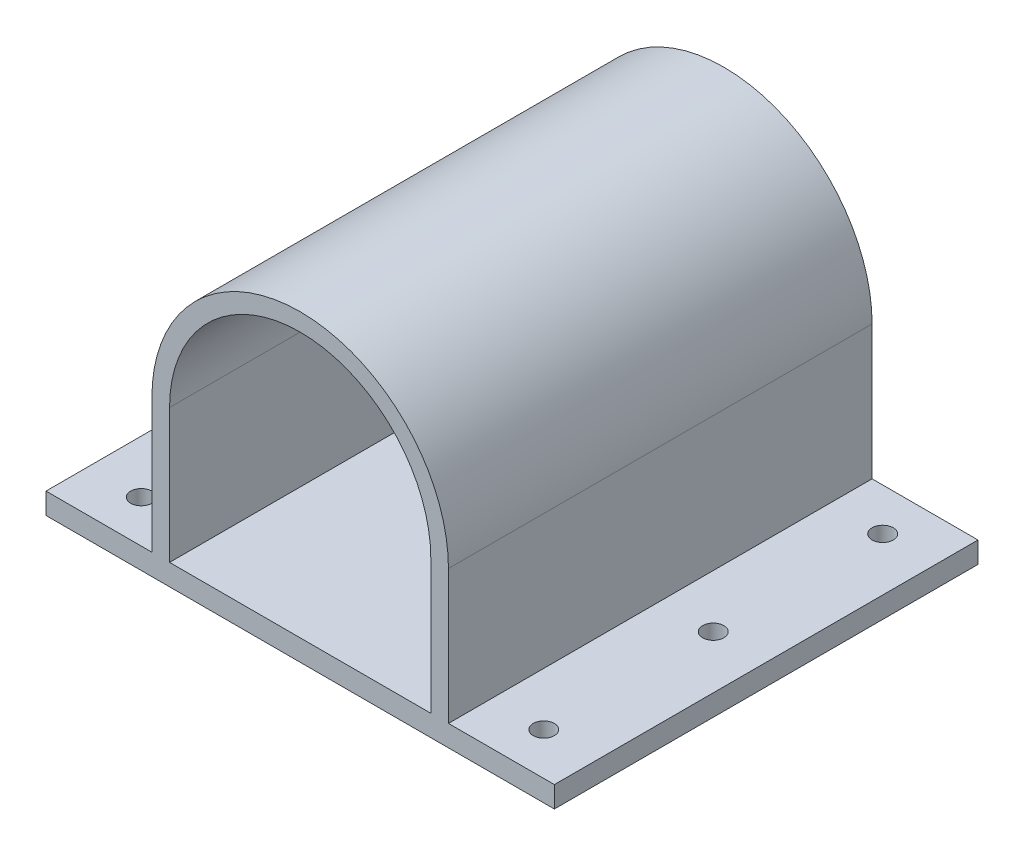
ISO-10303-21;
HEADER;
FILE_DESCRIPTION(('STEP AP214'),'2;1');
FILE_NAME('part.step','',(''),(''),'','','');
FILE_SCHEMA(('AUTOMOTIVE_DESIGN { 1 0 10303 214 1 1 1 1 }'));
ENDSEC;
DATA;
#1=APPLICATION_CONTEXT('core data for automotive mechanical design processes');
#2=APPLICATION_PROTOCOL_DEFINITION('international standard','automotive_design',2000,#1);
#3=PRODUCT_CONTEXT('',#1,'mechanical');
#4=PRODUCT('Part','Part','',(#3));
#5=PRODUCT_RELATED_PRODUCT_CATEGORY('part','',(#4));
#6=PRODUCT_DEFINITION_FORMATION('','',#4);
#7=PRODUCT_DEFINITION_CONTEXT('part definition',#1,'design');
#8=PRODUCT_DEFINITION('design','',#6,#7);
#9=PRODUCT_DEFINITION_SHAPE('','',#8);
#10=(LENGTH_UNIT() NAMED_UNIT(*) SI_UNIT(.MILLI.,.METRE.));
#11=(NAMED_UNIT(*) PLANE_ANGLE_UNIT() SI_UNIT($,.RADIAN.));
#12=(NAMED_UNIT(*) SI_UNIT($,.STERADIAN.) SOLID_ANGLE_UNIT());
#13=UNCERTAINTY_MEASURE_WITH_UNIT(LENGTH_MEASURE(1.E-05),#10,'distance_accuracy_value','');
#14=(GEOMETRIC_REPRESENTATION_CONTEXT(3) GLOBAL_UNCERTAINTY_ASSIGNED_CONTEXT((#13)) GLOBAL_UNIT_ASSIGNED_CONTEXT((#10,
#11,#12)) REPRESENTATION_CONTEXT('',''));
#15=CARTESIAN_POINT('',(0.,0.,0.));
#16=DIRECTION('',(0.,0.,1.));
#17=DIRECTION('',(1.,0.,0.));
#18=AXIS2_PLACEMENT_3D('',#15,#16,#17);
#19=CARTESIAN_POINT('',(0.,-7.,60.));
#20=DIRECTION('',(0.,0.,-1.));
#21=DIRECTION('',(-1.,0.,0.));
#22=AXIS2_PLACEMENT_3D('',#19,#20,#21);
#23=CYLINDRICAL_SURFACE('',#22,6.15);
#24=CARTESIAN_POINT('',(0.,-7.,0.));
#25=DIRECTION('',(0.,0.,1.));
#26=DIRECTION('',(1.,0.,0.));
#27=AXIS2_PLACEMENT_3D('',#24,#25,#26);
#28=CIRCLE('',#27,6.15);
#29=CARTESIAN_POINT('',(6.15,-7.,0.));
#30=VERTEX_POINT('',#29);
#31=EDGE_CURVE('E150',#30,#30,#28,.T.);
#32=ORIENTED_EDGE('',*,*,#31,.F.);
#33=EDGE_LOOP('',(#32));
#34=FACE_BOUND('',#33,.T.);
#35=CARTESIAN_POINT('',(0.,-7.,3.));
#36=DIRECTION('',(0.,0.,1.));
#37=DIRECTION('',(1.,0.,0.));
#38=AXIS2_PLACEMENT_3D('',#35,#36,#37);
#39=CIRCLE('',#38,6.15);
#40=CARTESIAN_POINT('',(6.15,-7.,3.));
#41=VERTEX_POINT('',#40);
#42=EDGE_CURVE('E217',#41,#41,#39,.T.);
#43=ORIENTED_EDGE('',*,*,#42,.T.);
#44=EDGE_LOOP('',(#43));
#45=FACE_BOUND('',#44,.T.);
#46=ADVANCED_FACE('F36',(#34,#45),#23,.F.);
#47=CARTESIAN_POINT('',(-15.5,0.,60.));
#48=DIRECTION('',(0.,0.,-1.));
#49=DIRECTION('',(-1.,0.,0.));
#50=AXIS2_PLACEMENT_3D('',#47,#48,#49);
#51=CYLINDRICAL_SURFACE('',#50,1.65);
#52=CARTESIAN_POINT('',(-15.5,0.,0.));
#53=DIRECTION('',(0.,0.,1.));
#54=DIRECTION('',(1.,0.,0.));
#55=AXIS2_PLACEMENT_3D('',#52,#53,#54);
#56=CIRCLE('',#55,1.65);
#57=CARTESIAN_POINT('',(-13.85,0.,0.));
#58=VERTEX_POINT('',#57);
#59=EDGE_CURVE('E199',#58,#58,#56,.T.);
#60=ORIENTED_EDGE('',*,*,#59,.F.);
#61=EDGE_LOOP('',(#60));
#62=FACE_BOUND('',#61,.T.);
#63=CARTESIAN_POINT('',(-15.5,0.,3.));
#64=DIRECTION('',(0.,0.,1.));
#65=DIRECTION('',(1.,0.,0.));
#66=AXIS2_PLACEMENT_3D('',#63,#64,#65);
#67=CIRCLE('',#66,1.65);
#68=CARTESIAN_POINT('',(-13.85,0.,3.));
#69=VERTEX_POINT('',#68);
#70=EDGE_CURVE('E220',#69,#69,#67,.T.);
#71=ORIENTED_EDGE('',*,*,#70,.T.);
#72=EDGE_LOOP('',(#71));
#73=FACE_BOUND('',#72,.T.);
#74=ADVANCED_FACE('F320',(#62,#73),#51,.F.);
#75=CARTESIAN_POINT('',(-7.75,13.4233937586588,60.));
#76=DIRECTION('',(0.,0.,-1.));
#77=DIRECTION('',(-1.,0.,0.));
#78=AXIS2_PLACEMENT_3D('',#75,#76,#77);
#79=CYLINDRICAL_SURFACE('',#78,1.65);
#80=CARTESIAN_POINT('',(-7.75,13.4233937586588,0.));
#81=DIRECTION('',(0.,0.,1.));
#82=DIRECTION('',(1.,0.,0.));
#83=AXIS2_PLACEMENT_3D('',#80,#81,#82);
#84=CIRCLE('',#83,1.65);
#85=CARTESIAN_POINT('',(-6.1,13.4233937586588,0.));
#86=VERTEX_POINT('',#85);
#87=EDGE_CURVE('E202',#86,#86,#84,.T.);
#88=ORIENTED_EDGE('',*,*,#87,.F.);
#89=EDGE_LOOP('',(#88));
#90=FACE_BOUND('',#89,.T.);
#91=CARTESIAN_POINT('',(-7.75,13.4233937586588,3.));
#92=DIRECTION('',(0.,0.,1.));
#93=DIRECTION('',(1.,0.,0.));
#94=AXIS2_PLACEMENT_3D('',#91,#92,#93);
#95=CIRCLE('',#94,1.65);
#96=CARTESIAN_POINT('',(-6.1,13.4233937586588,3.));
#97=VERTEX_POINT('',#96);
#98=EDGE_CURVE('E223',#97,#97,#95,.T.);
#99=ORIENTED_EDGE('',*,*,#98,.T.);
#100=EDGE_LOOP('',(#99));
#101=FACE_BOUND('',#100,.T.);
#102=ADVANCED_FACE('F326',(#90,#101),#79,.F.);
#103=CARTESIAN_POINT('',(7.75,13.4233937586588,60.));
#104=DIRECTION('',(0.,0.,-1.));
#105=DIRECTION('',(-1.,0.,0.));
#106=AXIS2_PLACEMENT_3D('',#103,#104,#105);
#107=CYLINDRICAL_SURFACE('',#106,1.65);
#108=CARTESIAN_POINT('',(7.75,13.4233937586588,0.));
#109=DIRECTION('',(0.,0.,1.));
#110=DIRECTION('',(1.,0.,0.));
#111=AXIS2_PLACEMENT_3D('',#108,#109,#110);
#112=CIRCLE('',#111,1.65);
#113=CARTESIAN_POINT('',(9.4,13.4233937586588,0.));
#114=VERTEX_POINT('',#113);
#115=EDGE_CURVE('E205',#114,#114,#112,.T.);
#116=ORIENTED_EDGE('',*,*,#115,.F.);
#117=EDGE_LOOP('',(#116));
#118=FACE_BOUND('',#117,.T.);
#119=CARTESIAN_POINT('',(7.75,13.4233937586588,3.));
#120=DIRECTION('',(0.,0.,1.));
#121=DIRECTION('',(1.,0.,0.));
#122=AXIS2_PLACEMENT_3D('',#119,#120,#121);
#123=CIRCLE('',#122,1.65);
#124=CARTESIAN_POINT('',(9.4,13.4233937586588,3.));
#125=VERTEX_POINT('',#124);
#126=EDGE_CURVE('E226',#125,#125,#123,.T.);
#127=ORIENTED_EDGE('',*,*,#126,.T.);
#128=EDGE_LOOP('',(#127));
#129=FACE_BOUND('',#128,.T.);
#130=ADVANCED_FACE('F420',(#118,#129),#107,.F.);
#131=CARTESIAN_POINT('',(15.5,0.,60.));
#132=DIRECTION('',(0.,0.,-1.));
#133=DIRECTION('',(-1.,0.,0.));
#134=AXIS2_PLACEMENT_3D('',#131,#132,#133);
#135=CYLINDRICAL_SURFACE('',#134,1.65);
#136=CARTESIAN_POINT('',(15.5,0.,0.));
#137=DIRECTION('',(0.,0.,1.));
#138=DIRECTION('',(1.,0.,0.));
#139=AXIS2_PLACEMENT_3D('',#136,#137,#138);
#140=CIRCLE('',#139,1.65);
#141=CARTESIAN_POINT('',(17.15,0.,0.));
#142=VERTEX_POINT('',#141);
#143=EDGE_CURVE('E208',#142,#142,#140,.T.);
#144=ORIENTED_EDGE('',*,*,#143,.F.);
#145=EDGE_LOOP('',(#144));
#146=FACE_BOUND('',#145,.T.);
#147=CARTESIAN_POINT('',(15.5,0.,3.));
#148=DIRECTION('',(0.,0.,1.));
#149=DIRECTION('',(1.,0.,0.));
#150=AXIS2_PLACEMENT_3D('',#147,#148,#149);
#151=CIRCLE('',#150,1.65);
#152=CARTESIAN_POINT('',(17.15,0.,3.));
#153=VERTEX_POINT('',#152);
#154=EDGE_CURVE('E229',#153,#153,#151,.T.);
#155=ORIENTED_EDGE('',*,*,#154,.T.);
#156=EDGE_LOOP('',(#155));
#157=FACE_BOUND('',#156,.T.);
#158=ADVANCED_FACE('F416',(#146,#157),#135,.F.);
#159=CARTESIAN_POINT('',(7.75000000000001,-13.4233937586588,60.));
#160=DIRECTION('',(0.,0.,-1.));
#161=DIRECTION('',(-1.,0.,0.));
#162=AXIS2_PLACEMENT_3D('',#159,#160,#161);
#163=CYLINDRICAL_SURFACE('',#162,1.65);
#164=CARTESIAN_POINT('',(7.75000000000001,-13.4233937586588,0.));
#165=DIRECTION('',(0.,0.,1.));
#166=DIRECTION('',(1.,0.,0.));
#167=AXIS2_PLACEMENT_3D('',#164,#165,#166);
#168=CIRCLE('',#167,1.65);
#169=CARTESIAN_POINT('',(9.40000000000001,-13.4233937586588,0.));
#170=VERTEX_POINT('',#169);
#171=EDGE_CURVE('E211',#170,#170,#168,.T.);
#172=ORIENTED_EDGE('',*,*,#171,.F.);
#173=EDGE_LOOP('',(#172));
#174=FACE_BOUND('',#173,.T.);
#175=CARTESIAN_POINT('',(7.75000000000001,-13.4233937586588,3.));
#176=DIRECTION('',(0.,0.,1.));
#177=DIRECTION('',(1.,0.,0.));
#178=AXIS2_PLACEMENT_3D('',#175,#176,#177);
#179=CIRCLE('',#178,1.65);
#180=CARTESIAN_POINT('',(9.40000000000001,-13.4233937586588,3.));
#181=VERTEX_POINT('',#180);
#182=EDGE_CURVE('E232',#181,#181,#179,.T.);
#183=ORIENTED_EDGE('',*,*,#182,.T.);
#184=EDGE_LOOP('',(#183));
#185=FACE_BOUND('',#184,.T.);
#186=ADVANCED_FACE('F412',(#174,#185),#163,.F.);
#187=CARTESIAN_POINT('',(-7.74999999999999,-13.4233937586588,60.));
#188=DIRECTION('',(0.,0.,-1.));
#189=DIRECTION('',(-1.,0.,0.));
#190=AXIS2_PLACEMENT_3D('',#187,#188,#189);
#191=CYLINDRICAL_SURFACE('',#190,1.65);
#192=CARTESIAN_POINT('',(-7.74999999999999,-13.4233937586588,0.));
#193=DIRECTION('',(0.,0.,1.));
#194=DIRECTION('',(1.,0.,0.));
#195=AXIS2_PLACEMENT_3D('',#192,#193,#194);
#196=CIRCLE('',#195,1.65);
#197=CARTESIAN_POINT('',(-6.09999999999999,-13.4233937586588,0.));
#198=VERTEX_POINT('',#197);
#199=EDGE_CURVE('E214',#198,#198,#196,.T.);
#200=ORIENTED_EDGE('',*,*,#199,.F.);
#201=EDGE_LOOP('',(#200));
#202=FACE_BOUND('',#201,.T.);
#203=CARTESIAN_POINT('',(-7.74999999999999,-13.4233937586588,3.));
#204=DIRECTION('',(0.,0.,1.));
#205=DIRECTION('',(1.,0.,0.));
#206=AXIS2_PLACEMENT_3D('',#203,#204,#205);
#207=CIRCLE('',#206,1.65);
#208=CARTESIAN_POINT('',(-6.09999999999999,-13.4233937586588,3.));
#209=VERTEX_POINT('',#208);
#210=EDGE_CURVE('E40',#209,#209,#207,.T.);
#211=ORIENTED_EDGE('',*,*,#210,.T.);
#212=EDGE_LOOP('',(#211));
#213=FACE_BOUND('',#212,.T.);
#214=ADVANCED_FACE('F335',(#202,#213),#191,.F.);
#215=CARTESIAN_POINT('',(0.,0.,60.));
#216=DIRECTION('',(0.,0.,1.));
#217=DIRECTION('',(1.,0.,0.));
#218=AXIS2_PLACEMENT_3D('',#215,#216,#217);
#219=PLANE('',#218);
#220=CARTESIAN_POINT('',(0.,0.,60.));
#221=DIRECTION('',(0.,0.,1.));
#222=DIRECTION('',(1.,0.,0.));
#223=AXIS2_PLACEMENT_3D('',#220,#221,#222);
#224=CIRCLE('',#223,18.5);
#225=CARTESIAN_POINT('',(18.5,0.,60.));
#226=VERTEX_POINT('',#225);
#227=CARTESIAN_POINT('',(-18.5,0.,60.));
#228=VERTEX_POINT('',#227);
#229=EDGE_CURVE('E52',#226,#228,#224,.T.);
#230=ORIENTED_EDGE('',*,*,#229,.F.);
#231=DIRECTION('',(0.,1.,0.));
#232=VECTOR('',#231,1.);
#233=CARTESIAN_POINT('',(18.5,-19.,60.));
#234=LINE('',#233,#232);
#235=CARTESIAN_POINT('',(18.5,-19.,60.));
#236=VERTEX_POINT('',#235);
#237=EDGE_CURVE('E246',#236,#226,#234,.T.);
#238=ORIENTED_EDGE('',*,*,#237,.F.);
#239=DIRECTION('',(1.,0.,0.));
#240=VECTOR('',#239,1.);
#241=CARTESIAN_POINT('',(-18.5,-19.,60.));
#242=LINE('',#241,#240);
#243=CARTESIAN_POINT('',(-18.5,-19.,60.));
#244=VERTEX_POINT('',#243);
#245=EDGE_CURVE('E250',#244,#236,#242,.T.);
#246=ORIENTED_EDGE('',*,*,#245,.F.);
#247=DIRECTION('',(0.,-1.,0.));
#248=VECTOR('',#247,1.);
#249=CARTESIAN_POINT('',(-18.5,0.,60.));
#250=LINE('',#249,#248);
#251=EDGE_CURVE('E253',#228,#244,#250,.T.);
#252=ORIENTED_EDGE('',*,*,#251,.F.);
#253=EDGE_LOOP('',(#230,#238,#246,#252));
#254=FACE_BOUND('',#253,.T.);
#255=CARTESIAN_POINT('',(0.,0.,60.));
#256=DIRECTION('',(0.,0.,1.));
#257=DIRECTION('',(1.,0.,0.));
#258=AXIS2_PLACEMENT_3D('',#255,#256,#257);
#259=CIRCLE('',#258,21.);
#260=CARTESIAN_POINT('',(21.,0.,60.));
#261=VERTEX_POINT('',#260);
#262=CARTESIAN_POINT('',(-21.,0.,60.));
#263=VERTEX_POINT('',#262);
#264=EDGE_CURVE('E162',#261,#263,#259,.T.);
#265=ORIENTED_EDGE('',*,*,#264,.T.);
#266=DIRECTION('',(0.,-1.,0.));
#267=VECTOR('',#266,1.);
#268=CARTESIAN_POINT('',(-21.,0.,60.));
#269=LINE('',#268,#267);
#270=CARTESIAN_POINT('',(-21.,-19.,60.));
#271=VERTEX_POINT('',#270);
#272=EDGE_CURVE('E102',#263,#271,#269,.T.);
#273=ORIENTED_EDGE('',*,*,#272,.T.);
#274=DIRECTION('',(-1.,0.,0.));
#275=VECTOR('',#274,1.);
#276=CARTESIAN_POINT('',(-21.,-19.,60.));
#277=LINE('',#276,#275);
#278=CARTESIAN_POINT('',(-36.,-19.,60.));
#279=VERTEX_POINT('',#278);
#280=EDGE_CURVE('E178',#271,#279,#277,.T.);
#281=ORIENTED_EDGE('',*,*,#280,.T.);
#282=DIRECTION('',(0.,-1.,0.));
#283=VECTOR('',#282,1.);
#284=CARTESIAN_POINT('',(-36.,-19.,60.));
#285=LINE('',#284,#283);
#286=CARTESIAN_POINT('',(-36.,-22.,60.));
#287=VERTEX_POINT('',#286);
#288=EDGE_CURVE('E191',#279,#287,#285,.T.);
#289=ORIENTED_EDGE('',*,*,#288,.T.);
#290=DIRECTION('',(1.,0.,0.));
#291=VECTOR('',#290,1.);
#292=CARTESIAN_POINT('',(-36.,-22.,60.));
#293=LINE('',#292,#291);
#294=CARTESIAN_POINT('',(36.,-22.,60.));
#295=VERTEX_POINT('',#294);
#296=EDGE_CURVE('E125',#287,#295,#293,.T.);
#297=ORIENTED_EDGE('',*,*,#296,.T.);
#298=DIRECTION('',(0.,1.,0.));
#299=VECTOR('',#298,1.);
#300=CARTESIAN_POINT('',(36.,-22.,60.));
#301=LINE('',#300,#299);
#302=CARTESIAN_POINT('',(36.,-19.,60.));
#303=VERTEX_POINT('',#302);
#304=EDGE_CURVE('E118',#295,#303,#301,.T.);
#305=ORIENTED_EDGE('',*,*,#304,.T.);
#306=DIRECTION('',(-1.,0.,0.));
#307=VECTOR('',#306,1.);
#308=CARTESIAN_POINT('',(36.,-19.,60.));
#309=LINE('',#308,#307);
#310=CARTESIAN_POINT('',(21.,-19.,60.));
#311=VERTEX_POINT('',#310);
#312=EDGE_CURVE('E122',#303,#311,#309,.T.);
#313=ORIENTED_EDGE('',*,*,#312,.T.);
#314=DIRECTION('',(0.,1.,0.));
#315=VECTOR('',#314,1.);
#316=CARTESIAN_POINT('',(21.,-19.,60.));
#317=LINE('',#316,#315);
#318=EDGE_CURVE('E61',#311,#261,#317,.T.);
#319=ORIENTED_EDGE('',*,*,#318,.T.);
#320=EDGE_LOOP('',(#265,#273,#281,#289,#297,#305,#313,#319));
#321=FACE_BOUND('',#320,.T.);
#322=ADVANCED_FACE('F120',(#254,#321),#219,.T.);
#323=CARTESIAN_POINT('',(0.,0.,0.));
#324=DIRECTION('',(0.,0.,1.));
#325=DIRECTION('',(1.,0.,0.));
#326=AXIS2_PLACEMENT_3D('',#323,#324,#325);
#327=PLANE('',#326);
#328=CARTESIAN_POINT('',(0.,0.,0.));
#329=DIRECTION('',(0.,0.,1.));
#330=DIRECTION('',(1.,0.,0.));
#331=AXIS2_PLACEMENT_3D('',#328,#329,#330);
#332=CIRCLE('',#331,21.);
#333=CARTESIAN_POINT('',(21.,0.,0.));
#334=VERTEX_POINT('',#333);
#335=CARTESIAN_POINT('',(-21.,0.,0.));
#336=VERTEX_POINT('',#335);
#337=EDGE_CURVE('E146',#334,#336,#332,.T.);
#338=ORIENTED_EDGE('',*,*,#337,.F.);
#339=DIRECTION('',(0.,1.,0.));
#340=VECTOR('',#339,1.);
#341=CARTESIAN_POINT('',(21.,-19.,0.));
#342=LINE('',#341,#340);
#343=CARTESIAN_POINT('',(21.,-19.,0.));
#344=VERTEX_POINT('',#343);
#345=EDGE_CURVE('E94',#344,#334,#342,.T.);
#346=ORIENTED_EDGE('',*,*,#345,.F.);
#347=DIRECTION('',(-1.,0.,0.));
#348=VECTOR('',#347,1.);
#349=CARTESIAN_POINT('',(36.,-19.,0.));
#350=LINE('',#349,#348);
#351=CARTESIAN_POINT('',(36.,-19.,0.));
#352=VERTEX_POINT('',#351);
#353=EDGE_CURVE('E159',#352,#344,#350,.T.);
#354=ORIENTED_EDGE('',*,*,#353,.F.);
#355=DIRECTION('',(0.,1.,0.));
#356=VECTOR('',#355,1.);
#357=CARTESIAN_POINT('',(36.,-22.,0.));
#358=LINE('',#357,#356);
#359=CARTESIAN_POINT('',(36.,-22.,0.));
#360=VERTEX_POINT('',#359);
#361=EDGE_CURVE('E134',#360,#352,#358,.T.);
#362=ORIENTED_EDGE('',*,*,#361,.F.);
#363=DIRECTION('',(1.,0.,0.));
#364=VECTOR('',#363,1.);
#365=CARTESIAN_POINT('',(-36.,-22.,0.));
#366=LINE('',#365,#364);
#367=CARTESIAN_POINT('',(-36.,-22.,0.));
#368=VERTEX_POINT('',#367);
#369=EDGE_CURVE('E156',#368,#360,#366,.T.);
#370=ORIENTED_EDGE('',*,*,#369,.F.);
#371=DIRECTION('',(0.,-1.,0.));
#372=VECTOR('',#371,1.);
#373=CARTESIAN_POINT('',(-36.,-19.,0.));
#374=LINE('',#373,#372);
#375=CARTESIAN_POINT('',(-36.,-19.,0.));
#376=VERTEX_POINT('',#375);
#377=EDGE_CURVE('E154',#376,#368,#374,.T.);
#378=ORIENTED_EDGE('',*,*,#377,.F.);
#379=DIRECTION('',(-1.,0.,0.));
#380=VECTOR('',#379,1.);
#381=CARTESIAN_POINT('',(-21.,-19.,0.));
#382=LINE('',#381,#380);
#383=CARTESIAN_POINT('',(-21.,-19.,0.));
#384=VERTEX_POINT('',#383);
#385=EDGE_CURVE('E152',#384,#376,#382,.T.);
#386=ORIENTED_EDGE('',*,*,#385,.F.);
#387=DIRECTION('',(0.,-1.,0.));
#388=VECTOR('',#387,1.);
#389=CARTESIAN_POINT('',(-21.,0.,0.));
#390=LINE('',#389,#388);
#391=EDGE_CURVE('E149',#336,#384,#390,.T.);
#392=ORIENTED_EDGE('',*,*,#391,.F.);
#393=EDGE_LOOP('',(#338,#346,#354,#362,#370,#378,#386,#392));
#394=FACE_BOUND('',#393,.T.);
#395=ORIENTED_EDGE('',*,*,#31,.T.);
#396=EDGE_LOOP('',(#395));
#397=FACE_BOUND('',#396,.T.);
#398=ORIENTED_EDGE('',*,*,#59,.T.);
#399=EDGE_LOOP('',(#398));
#400=FACE_BOUND('',#399,.T.);
#401=ORIENTED_EDGE('',*,*,#87,.T.);
#402=EDGE_LOOP('',(#401));
#403=FACE_BOUND('',#402,.T.);
#404=ORIENTED_EDGE('',*,*,#115,.T.);
#405=EDGE_LOOP('',(#404));
#406=FACE_BOUND('',#405,.T.);
#407=ORIENTED_EDGE('',*,*,#143,.T.);
#408=EDGE_LOOP('',(#407));
#409=FACE_BOUND('',#408,.T.);
#410=ORIENTED_EDGE('',*,*,#171,.T.);
#411=EDGE_LOOP('',(#410));
#412=FACE_BOUND('',#411,.T.);
#413=ORIENTED_EDGE('',*,*,#199,.T.);
#414=EDGE_LOOP('',(#413));
#415=FACE_BOUND('',#414,.T.);
#416=ADVANCED_FACE('F182',(#394,#397,#400,#403,#406,#409,#412,#415),#327,.F.);
#417=CARTESIAN_POINT('',(0.,0.,60.));
#418=DIRECTION('',(0.,0.,-1.));
#419=DIRECTION('',(-1.,0.,0.));
#420=AXIS2_PLACEMENT_3D('',#417,#418,#419);
#421=CYLINDRICAL_SURFACE('',#420,21.);
#422=ORIENTED_EDGE('',*,*,#337,.T.);
#423=DIRECTION('',(0.,0.,-1.));
#424=VECTOR('',#423,1.);
#425=CARTESIAN_POINT('',(-21.,0.,60.));
#426=LINE('',#425,#424);
#427=EDGE_CURVE('E11',#263,#336,#426,.T.);
#428=ORIENTED_EDGE('',*,*,#427,.F.);
#429=ORIENTED_EDGE('',*,*,#264,.F.);
#430=DIRECTION('',(0.,0.,-1.));
#431=VECTOR('',#430,1.);
#432=CARTESIAN_POINT('',(21.,0.,60.));
#433=LINE('',#432,#431);
#434=EDGE_CURVE('E142',#261,#334,#433,.T.);
#435=ORIENTED_EDGE('',*,*,#434,.T.);
#436=EDGE_LOOP('',(#422,#428,#429,#435));
#437=FACE_BOUND('',#436,.T.);
#438=ADVANCED_FACE('F38',(#437),#421,.T.);
#439=CARTESIAN_POINT('',(-21.,0.,60.));
#440=DIRECTION('',(1.,0.,0.));
#441=DIRECTION('',(0.,1.,0.));
#442=AXIS2_PLACEMENT_3D('',#439,#440,#441);
#443=PLANE('',#442);
#444=ORIENTED_EDGE('',*,*,#391,.T.);
#445=DIRECTION('',(0.,0.,-1.));
#446=VECTOR('',#445,1.);
#447=CARTESIAN_POINT('',(-21.,-19.,60.));
#448=LINE('',#447,#446);
#449=EDGE_CURVE('E45',#271,#384,#448,.T.);
#450=ORIENTED_EDGE('',*,*,#449,.F.);
#451=ORIENTED_EDGE('',*,*,#272,.F.);
#452=ORIENTED_EDGE('',*,*,#427,.T.);
#453=EDGE_LOOP('',(#444,#450,#451,#452));
#454=FACE_BOUND('',#453,.T.);
#455=ADVANCED_FACE('F341',(#454),#443,.F.);
#456=CARTESIAN_POINT('',(-21.,-19.,60.));
#457=DIRECTION('',(0.,-1.,0.));
#458=DIRECTION('',(0.,0.,-1.));
#459=AXIS2_PLACEMENT_3D('',#456,#457,#458);
#460=PLANE('',#459);
#461=CARTESIAN_POINT('',(-28.5,-19.,6.));
#462=DIRECTION('',(0.,1.,0.));
#463=DIRECTION('',(0.,0.,1.));
#464=AXIS2_PLACEMENT_3D('',#461,#462,#463);
#465=CIRCLE('',#464,1.5);
#466=CARTESIAN_POINT('',(-28.5,-19.,7.5));
#467=VERTEX_POINT('',#466);
#468=EDGE_CURVE('E271',#467,#467,#465,.T.);
#469=ORIENTED_EDGE('',*,*,#468,.F.);
#470=EDGE_LOOP('',(#469));
#471=FACE_BOUND('',#470,.T.);
#472=CARTESIAN_POINT('',(-28.5,-19.,54.));
#473=DIRECTION('',(0.,1.,0.));
#474=DIRECTION('',(0.,0.,1.));
#475=AXIS2_PLACEMENT_3D('',#472,#473,#474);
#476=CIRCLE('',#475,1.5);
#477=CARTESIAN_POINT('',(-28.5,-19.,55.5));
#478=VERTEX_POINT('',#477);
#479=EDGE_CURVE('E290',#478,#478,#476,.T.);
#480=ORIENTED_EDGE('',*,*,#479,.F.);
#481=EDGE_LOOP('',(#480));
#482=FACE_BOUND('',#481,.T.);
#483=CARTESIAN_POINT('',(-28.5,-19.,30.));
#484=DIRECTION('',(0.,1.,0.));
#485=DIRECTION('',(0.,0.,1.));
#486=AXIS2_PLACEMENT_3D('',#483,#484,#485);
#487=CIRCLE('',#486,1.5);
#488=CARTESIAN_POINT('',(-28.5,-19.,31.5));
#489=VERTEX_POINT('',#488);
#490=EDGE_CURVE('E268',#489,#489,#487,.T.);
#491=ORIENTED_EDGE('',*,*,#490,.F.);
#492=EDGE_LOOP('',(#491));
#493=FACE_BOUND('',#492,.T.);
#494=ORIENTED_EDGE('',*,*,#385,.T.);
#495=DIRECTION('',(0.,0.,-1.));
#496=VECTOR('',#495,1.);
#497=CARTESIAN_POINT('',(-36.,-19.,60.));
#498=LINE('',#497,#496);
#499=EDGE_CURVE('E169',#279,#376,#498,.T.);
#500=ORIENTED_EDGE('',*,*,#499,.F.);
#501=ORIENTED_EDGE('',*,*,#280,.F.);
#502=ORIENTED_EDGE('',*,*,#449,.T.);
#503=EDGE_LOOP('',(#494,#500,#501,#502));
#504=FACE_BOUND('',#503,.T.);
#505=ADVANCED_FACE('F176',(#471,#482,#493,#504),#460,.F.);
#506=CARTESIAN_POINT('',(-36.,-19.,60.));
#507=DIRECTION('',(1.,0.,0.));
#508=DIRECTION('',(0.,1.,0.));
#509=AXIS2_PLACEMENT_3D('',#506,#507,#508);
#510=PLANE('',#509);
#511=ORIENTED_EDGE('',*,*,#377,.T.);
#512=DIRECTION('',(0.,0.,-1.));
#513=VECTOR('',#512,1.);
#514=CARTESIAN_POINT('',(-36.,-22.,60.));
#515=LINE('',#514,#513);
#516=EDGE_CURVE('E166',#287,#368,#515,.T.);
#517=ORIENTED_EDGE('',*,*,#516,.F.);
#518=ORIENTED_EDGE('',*,*,#288,.F.);
#519=ORIENTED_EDGE('',*,*,#499,.T.);
#520=EDGE_LOOP('',(#511,#517,#518,#519));
#521=FACE_BOUND('',#520,.T.);
#522=ADVANCED_FACE('F187',(#521),#510,.F.);
#523=CARTESIAN_POINT('',(-36.,-22.,60.));
#524=DIRECTION('',(0.,1.,0.));
#525=DIRECTION('',(0.,0.,1.));
#526=AXIS2_PLACEMENT_3D('',#523,#524,#525);
#527=PLANE('',#526);
#528=CARTESIAN_POINT('',(-28.5,-22.,6.));
#529=DIRECTION('',(0.,1.,0.));
#530=DIRECTION('',(0.,0.,1.));
#531=AXIS2_PLACEMENT_3D('',#528,#529,#530);
#532=CIRCLE('',#531,1.5);
#533=CARTESIAN_POINT('',(-28.5,-22.,7.5));
#534=VERTEX_POINT('',#533);
#535=EDGE_CURVE('E293',#534,#534,#532,.T.);
#536=ORIENTED_EDGE('',*,*,#535,.T.);
#537=EDGE_LOOP('',(#536));
#538=FACE_BOUND('',#537,.T.);
#539=CARTESIAN_POINT('',(-28.5,-22.,54.));
#540=DIRECTION('',(0.,1.,0.));
#541=DIRECTION('',(0.,0.,1.));
#542=AXIS2_PLACEMENT_3D('',#539,#540,#541);
#543=CIRCLE('',#542,1.5);
#544=CARTESIAN_POINT('',(-28.5,-22.,55.5));
#545=VERTEX_POINT('',#544);
#546=EDGE_CURVE('E287',#545,#545,#543,.T.);
#547=ORIENTED_EDGE('',*,*,#546,.T.);
#548=EDGE_LOOP('',(#547));
#549=FACE_BOUND('',#548,.T.);
#550=CARTESIAN_POINT('',(28.5,-22.,54.));
#551=DIRECTION('',(0.,1.,0.));
#552=DIRECTION('',(0.,0.,-1.));
#553=AXIS2_PLACEMENT_3D('',#550,#551,#552);
#554=CIRCLE('',#553,1.5);
#555=CARTESIAN_POINT('',(28.5,-22.,52.5));
#556=VERTEX_POINT('',#555);
#557=EDGE_CURVE('E281',#556,#556,#554,.T.);
#558=ORIENTED_EDGE('',*,*,#557,.T.);
#559=EDGE_LOOP('',(#558));
#560=FACE_BOUND('',#559,.T.);
#561=CARTESIAN_POINT('',(28.5,-22.,6.00000000000001));
#562=DIRECTION('',(0.,1.,0.));
#563=DIRECTION('',(0.,0.,-1.));
#564=AXIS2_PLACEMENT_3D('',#561,#562,#563);
#565=CIRCLE('',#564,1.5);
#566=CARTESIAN_POINT('',(28.5,-22.,4.50000000000001));
#567=VERTEX_POINT('',#566);
#568=EDGE_CURVE('E274',#567,#567,#565,.T.);
#569=ORIENTED_EDGE('',*,*,#568,.T.);
#570=EDGE_LOOP('',(#569));
#571=FACE_BOUND('',#570,.T.);
#572=CARTESIAN_POINT('',(28.5,-22.,30.));
#573=DIRECTION('',(0.,1.,0.));
#574=DIRECTION('',(0.,0.,-1.));
#575=AXIS2_PLACEMENT_3D('',#572,#573,#574);
#576=CIRCLE('',#575,1.5);
#577=CARTESIAN_POINT('',(28.5,-22.,28.5));
#578=VERTEX_POINT('',#577);
#579=EDGE_CURVE('E298',#578,#578,#576,.T.);
#580=ORIENTED_EDGE('',*,*,#579,.T.);
#581=EDGE_LOOP('',(#580));
#582=FACE_BOUND('',#581,.T.);
#583=CARTESIAN_POINT('',(-28.5,-22.,30.));
#584=DIRECTION('',(0.,1.,0.));
#585=DIRECTION('',(0.,0.,1.));
#586=AXIS2_PLACEMENT_3D('',#583,#584,#585);
#587=CIRCLE('',#586,1.5);
#588=CARTESIAN_POINT('',(-28.5,-22.,31.5));
#589=VERTEX_POINT('',#588);
#590=EDGE_CURVE('E257',#589,#589,#587,.T.);
#591=ORIENTED_EDGE('',*,*,#590,.T.);
#592=EDGE_LOOP('',(#591));
#593=FACE_BOUND('',#592,.T.);
#594=ORIENTED_EDGE('',*,*,#369,.T.);
#595=DIRECTION('',(0.,0.,-1.));
#596=VECTOR('',#595,1.);
#597=CARTESIAN_POINT('',(36.,-22.,60.));
#598=LINE('',#597,#596);
#599=EDGE_CURVE('E137',#295,#360,#598,.T.);
#600=ORIENTED_EDGE('',*,*,#599,.F.);
#601=ORIENTED_EDGE('',*,*,#296,.F.);
#602=ORIENTED_EDGE('',*,*,#516,.T.);
#603=EDGE_LOOP('',(#594,#600,#601,#602));
#604=FACE_BOUND('',#603,.T.);
#605=ADVANCED_FACE('F190',(#538,#549,#560,#571,#582,#593,#604),#527,.F.);
#606=CARTESIAN_POINT('',(36.,-22.,60.));
#607=DIRECTION('',(-1.,0.,0.));
#608=DIRECTION('',(0.,-1.,0.));
#609=AXIS2_PLACEMENT_3D('',#606,#607,#608);
#610=PLANE('',#609);
#611=ORIENTED_EDGE('',*,*,#361,.T.);
#612=DIRECTION('',(0.,0.,-1.));
#613=VECTOR('',#612,1.);
#614=CARTESIAN_POINT('',(36.,-19.,60.));
#615=LINE('',#614,#613);
#616=EDGE_CURVE('E131',#303,#352,#615,.T.);
#617=ORIENTED_EDGE('',*,*,#616,.F.);
#618=ORIENTED_EDGE('',*,*,#304,.F.);
#619=ORIENTED_EDGE('',*,*,#599,.T.);
#620=EDGE_LOOP('',(#611,#617,#618,#619));
#621=FACE_BOUND('',#620,.T.);
#622=ADVANCED_FACE('F132',(#621),#610,.F.);
#623=CARTESIAN_POINT('',(36.,-19.,60.));
#624=DIRECTION('',(0.,-1.,0.));
#625=DIRECTION('',(0.,0.,-1.));
#626=AXIS2_PLACEMENT_3D('',#623,#624,#625);
#627=PLANE('',#626);
#628=CARTESIAN_POINT('',(28.5,-19.,54.));
#629=DIRECTION('',(0.,1.,0.));
#630=DIRECTION('',(0.,0.,-1.));
#631=AXIS2_PLACEMENT_3D('',#628,#629,#630);
#632=CIRCLE('',#631,1.5);
#633=CARTESIAN_POINT('',(28.5,-19.,52.5));
#634=VERTEX_POINT('',#633);
#635=EDGE_CURVE('E284',#634,#634,#632,.T.);
#636=ORIENTED_EDGE('',*,*,#635,.F.);
#637=EDGE_LOOP('',(#636));
#638=FACE_BOUND('',#637,.T.);
#639=CARTESIAN_POINT('',(28.5,-19.,6.00000000000001));
#640=DIRECTION('',(0.,1.,0.));
#641=DIRECTION('',(0.,0.,-1.));
#642=AXIS2_PLACEMENT_3D('',#639,#640,#641);
#643=CIRCLE('',#642,1.5);
#644=CARTESIAN_POINT('',(28.5,-19.,4.50000000000001));
#645=VERTEX_POINT('',#644);
#646=EDGE_CURVE('E277',#645,#645,#643,.T.);
#647=ORIENTED_EDGE('',*,*,#646,.F.);
#648=EDGE_LOOP('',(#647));
#649=FACE_BOUND('',#648,.T.);
#650=CARTESIAN_POINT('',(28.5,-19.,30.));
#651=DIRECTION('',(0.,1.,0.));
#652=DIRECTION('',(0.,0.,-1.));
#653=AXIS2_PLACEMENT_3D('',#650,#651,#652);
#654=CIRCLE('',#653,1.5);
#655=CARTESIAN_POINT('',(28.5,-19.,28.5));
#656=VERTEX_POINT('',#655);
#657=EDGE_CURVE('E278',#656,#656,#654,.T.);
#658=ORIENTED_EDGE('',*,*,#657,.F.);
#659=EDGE_LOOP('',(#658));
#660=FACE_BOUND('',#659,.T.);
#661=ORIENTED_EDGE('',*,*,#353,.T.);
#662=DIRECTION('',(0.,0.,-1.));
#663=VECTOR('',#662,1.);
#664=CARTESIAN_POINT('',(21.,-19.,60.));
#665=LINE('',#664,#663);
#666=EDGE_CURVE('E138',#311,#344,#665,.T.);
#667=ORIENTED_EDGE('',*,*,#666,.F.);
#668=ORIENTED_EDGE('',*,*,#312,.F.);
#669=ORIENTED_EDGE('',*,*,#616,.T.);
#670=EDGE_LOOP('',(#661,#667,#668,#669));
#671=FACE_BOUND('',#670,.T.);
#672=ADVANCED_FACE('F140',(#638,#649,#660,#671),#627,.F.);
#673=CARTESIAN_POINT('',(21.,-19.,60.));
#674=DIRECTION('',(-1.,0.,0.));
#675=DIRECTION('',(0.,-1.,0.));
#676=AXIS2_PLACEMENT_3D('',#673,#674,#675);
#677=PLANE('',#676);
#678=ORIENTED_EDGE('',*,*,#345,.T.);
#679=ORIENTED_EDGE('',*,*,#434,.F.);
#680=ORIENTED_EDGE('',*,*,#318,.F.);
#681=ORIENTED_EDGE('',*,*,#666,.T.);
#682=EDGE_LOOP('',(#678,#679,#680,#681));
#683=FACE_BOUND('',#682,.T.);
#684=ADVANCED_FACE('F307',(#683),#677,.F.);
#685=CARTESIAN_POINT('',(0.,0.,3.));
#686=DIRECTION('',(0.,0.,1.));
#687=DIRECTION('',(1.,0.,0.));
#688=AXIS2_PLACEMENT_3D('',#685,#686,#687);
#689=CYLINDRICAL_SURFACE('',#688,18.5);
#690=ORIENTED_EDGE('',*,*,#229,.T.);
#691=DIRECTION('',(0.,0.,1.));
#692=VECTOR('',#691,1.);
#693=CARTESIAN_POINT('',(-18.5,0.,3.));
#694=LINE('',#693,#692);
#695=CARTESIAN_POINT('',(-18.5,0.,3.));
#696=VERTEX_POINT('',#695);
#697=EDGE_CURVE('E235',#696,#228,#694,.T.);
#698=ORIENTED_EDGE('',*,*,#697,.F.);
#699=CARTESIAN_POINT('',(0.,0.,3.));
#700=DIRECTION('',(0.,0.,1.));
#701=DIRECTION('',(1.,0.,0.));
#702=AXIS2_PLACEMENT_3D('',#699,#700,#701);
#703=CIRCLE('',#702,18.5);
#704=CARTESIAN_POINT('',(18.5,0.,3.));
#705=VERTEX_POINT('',#704);
#706=EDGE_CURVE('E249',#705,#696,#703,.T.);
#707=ORIENTED_EDGE('',*,*,#706,.F.);
#708=DIRECTION('',(0.,0.,1.));
#709=VECTOR('',#708,1.);
#710=CARTESIAN_POINT('',(18.5,0.,3.));
#711=LINE('',#710,#709);
#712=EDGE_CURVE('E244',#705,#226,#711,.T.);
#713=ORIENTED_EDGE('',*,*,#712,.T.);
#714=EDGE_LOOP('',(#690,#698,#707,#713));
#715=FACE_BOUND('',#714,.T.);
#716=ADVANCED_FACE('F314',(#715),#689,.F.);
#717=CARTESIAN_POINT('',(18.5,-19.,3.));
#718=DIRECTION('',(1.,0.,0.));
#719=DIRECTION('',(0.,1.,0.));
#720=AXIS2_PLACEMENT_3D('',#717,#718,#719);
#721=PLANE('',#720);
#722=ORIENTED_EDGE('',*,*,#237,.T.);
#723=ORIENTED_EDGE('',*,*,#712,.F.);
#724=DIRECTION('',(0.,1.,0.));
#725=VECTOR('',#724,1.);
#726=CARTESIAN_POINT('',(18.5,-19.,3.));
#727=LINE('',#726,#725);
#728=CARTESIAN_POINT('',(18.5,-19.,3.));
#729=VERTEX_POINT('',#728);
#730=EDGE_CURVE('E238',#729,#705,#727,.T.);
#731=ORIENTED_EDGE('',*,*,#730,.F.);
#732=DIRECTION('',(0.,0.,1.));
#733=VECTOR('',#732,1.);
#734=CARTESIAN_POINT('',(18.5,-19.,3.));
#735=LINE('',#734,#733);
#736=EDGE_CURVE('E241',#729,#236,#735,.T.);
#737=ORIENTED_EDGE('',*,*,#736,.T.);
#738=EDGE_LOOP('',(#722,#723,#731,#737));
#739=FACE_BOUND('',#738,.T.);
#740=ADVANCED_FACE('F397',(#739),#721,.F.);
#741=CARTESIAN_POINT('',(-18.5,-19.,3.));
#742=DIRECTION('',(0.,-1.,0.));
#743=DIRECTION('',(0.,0.,-1.));
#744=AXIS2_PLACEMENT_3D('',#741,#742,#743);
#745=PLANE('',#744);
#746=ORIENTED_EDGE('',*,*,#245,.T.);
#747=ORIENTED_EDGE('',*,*,#736,.F.);
#748=DIRECTION('',(1.,0.,0.));
#749=VECTOR('',#748,1.);
#750=CARTESIAN_POINT('',(-18.5,-19.,3.));
#751=LINE('',#750,#749);
#752=CARTESIAN_POINT('',(-18.5,-19.,3.));
#753=VERTEX_POINT('',#752);
#754=EDGE_CURVE('E260',#753,#729,#751,.T.);
#755=ORIENTED_EDGE('',*,*,#754,.F.);
#756=DIRECTION('',(0.,0.,1.));
#757=VECTOR('',#756,1.);
#758=CARTESIAN_POINT('',(-18.5,-19.,3.));
#759=LINE('',#758,#757);
#760=EDGE_CURVE('E237',#753,#244,#759,.T.);
#761=ORIENTED_EDGE('',*,*,#760,.T.);
#762=EDGE_LOOP('',(#746,#747,#755,#761));
#763=FACE_BOUND('',#762,.T.);
#764=ADVANCED_FACE('F400',(#763),#745,.F.);
#765=CARTESIAN_POINT('',(-18.5,0.,3.));
#766=DIRECTION('',(-1.,0.,0.));
#767=DIRECTION('',(0.,-1.,0.));
#768=AXIS2_PLACEMENT_3D('',#765,#766,#767);
#769=PLANE('',#768);
#770=ORIENTED_EDGE('',*,*,#251,.T.);
#771=ORIENTED_EDGE('',*,*,#760,.F.);
#772=DIRECTION('',(0.,-1.,0.));
#773=VECTOR('',#772,1.);
#774=CARTESIAN_POINT('',(-18.5,0.,3.));
#775=LINE('',#774,#773);
#776=EDGE_CURVE('E263',#696,#753,#775,.T.);
#777=ORIENTED_EDGE('',*,*,#776,.F.);
#778=ORIENTED_EDGE('',*,*,#697,.T.);
#779=EDGE_LOOP('',(#770,#771,#777,#778));
#780=FACE_BOUND('',#779,.T.);
#781=ADVANCED_FACE('F395',(#780),#769,.F.);
#782=CARTESIAN_POINT('',(0.,0.,3.));
#783=DIRECTION('',(0.,0.,1.));
#784=DIRECTION('',(1.,0.,0.));
#785=AXIS2_PLACEMENT_3D('',#782,#783,#784);
#786=PLANE('',#785);
#787=ORIENTED_EDGE('',*,*,#42,.F.);
#788=EDGE_LOOP('',(#787));
#789=FACE_BOUND('',#788,.T.);
#790=ORIENTED_EDGE('',*,*,#70,.F.);
#791=EDGE_LOOP('',(#790));
#792=FACE_BOUND('',#791,.T.);
#793=ORIENTED_EDGE('',*,*,#98,.F.);
#794=EDGE_LOOP('',(#793));
#795=FACE_BOUND('',#794,.T.);
#796=ORIENTED_EDGE('',*,*,#126,.F.);
#797=EDGE_LOOP('',(#796));
#798=FACE_BOUND('',#797,.T.);
#799=ORIENTED_EDGE('',*,*,#154,.F.);
#800=EDGE_LOOP('',(#799));
#801=FACE_BOUND('',#800,.T.);
#802=ORIENTED_EDGE('',*,*,#182,.F.);
#803=EDGE_LOOP('',(#802));
#804=FACE_BOUND('',#803,.T.);
#805=ORIENTED_EDGE('',*,*,#210,.F.);
#806=EDGE_LOOP('',(#805));
#807=FACE_BOUND('',#806,.T.);
#808=ORIENTED_EDGE('',*,*,#706,.T.);
#809=ORIENTED_EDGE('',*,*,#776,.T.);
#810=ORIENTED_EDGE('',*,*,#754,.T.);
#811=ORIENTED_EDGE('',*,*,#730,.T.);
#812=EDGE_LOOP('',(#808,#809,#810,#811));
#813=FACE_BOUND('',#812,.T.);
#814=ADVANCED_FACE('F392',(#789,#792,#795,#798,#801,#804,#807,#813),#786,.T.);
#815=CARTESIAN_POINT('',(28.5,-22.,30.));
#816=DIRECTION('',(0.,1.,0.));
#817=DIRECTION('',(0.,0.,1.));
#818=AXIS2_PLACEMENT_3D('',#815,#816,#817);
#819=CYLINDRICAL_SURFACE('',#818,1.5);
#820=ORIENTED_EDGE('',*,*,#579,.F.);
#821=EDGE_LOOP('',(#820));
#822=FACE_BOUND('',#821,.T.);
#823=ORIENTED_EDGE('',*,*,#657,.T.);
#824=EDGE_LOOP('',(#823));
#825=FACE_BOUND('',#824,.T.);
#826=ADVANCED_FACE('F304',(#822,#825),#819,.F.);
#827=CARTESIAN_POINT('',(28.5,-22.,6.00000000000001));
#828=DIRECTION('',(0.,1.,0.));
#829=DIRECTION('',(0.,0.,1.));
#830=AXIS2_PLACEMENT_3D('',#827,#828,#829);
#831=CYLINDRICAL_SURFACE('',#830,1.5);
#832=ORIENTED_EDGE('',*,*,#568,.F.);
#833=EDGE_LOOP('',(#832));
#834=FACE_BOUND('',#833,.T.);
#835=ORIENTED_EDGE('',*,*,#646,.T.);
#836=EDGE_LOOP('',(#835));
#837=FACE_BOUND('',#836,.T.);
#838=ADVANCED_FACE('F387',(#834,#837),#831,.F.);
#839=CARTESIAN_POINT('',(28.5,-22.,54.));
#840=DIRECTION('',(0.,1.,0.));
#841=DIRECTION('',(0.,0.,1.));
#842=AXIS2_PLACEMENT_3D('',#839,#840,#841);
#843=CYLINDRICAL_SURFACE('',#842,1.5);
#844=ORIENTED_EDGE('',*,*,#557,.F.);
#845=EDGE_LOOP('',(#844));
#846=FACE_BOUND('',#845,.T.);
#847=ORIENTED_EDGE('',*,*,#635,.T.);
#848=EDGE_LOOP('',(#847));
#849=FACE_BOUND('',#848,.T.);
#850=ADVANCED_FACE('F376',(#846,#849),#843,.F.);
#851=CARTESIAN_POINT('',(-28.5,-22.,30.));
#852=DIRECTION('',(0.,1.,0.));
#853=DIRECTION('',(0.,0.,1.));
#854=AXIS2_PLACEMENT_3D('',#851,#852,#853);
#855=CYLINDRICAL_SURFACE('',#854,1.5);
#856=ORIENTED_EDGE('',*,*,#590,.F.);
#857=EDGE_LOOP('',(#856));
#858=FACE_BOUND('',#857,.T.);
#859=ORIENTED_EDGE('',*,*,#490,.T.);
#860=EDGE_LOOP('',(#859));
#861=FACE_BOUND('',#860,.T.);
#862=ADVANCED_FACE('F372',(#858,#861),#855,.F.);
#863=CARTESIAN_POINT('',(-28.5,-22.,54.));
#864=DIRECTION('',(0.,1.,0.));
#865=DIRECTION('',(0.,0.,1.));
#866=AXIS2_PLACEMENT_3D('',#863,#864,#865);
#867=CYLINDRICAL_SURFACE('',#866,1.5);
#868=ORIENTED_EDGE('',*,*,#546,.F.);
#869=EDGE_LOOP('',(#868));
#870=FACE_BOUND('',#869,.T.);
#871=ORIENTED_EDGE('',*,*,#479,.T.);
#872=EDGE_LOOP('',(#871));
#873=FACE_BOUND('',#872,.T.);
#874=ADVANCED_FACE('F375',(#870,#873),#867,.F.);
#875=CARTESIAN_POINT('',(-28.5,-22.,6.));
#876=DIRECTION('',(0.,1.,0.));
#877=DIRECTION('',(0.,0.,1.));
#878=AXIS2_PLACEMENT_3D('',#875,#876,#877);
#879=CYLINDRICAL_SURFACE('',#878,1.5);
#880=ORIENTED_EDGE('',*,*,#535,.F.);
#881=EDGE_LOOP('',(#880));
#882=FACE_BOUND('',#881,.T.);
#883=ORIENTED_EDGE('',*,*,#468,.T.);
#884=EDGE_LOOP('',(#883));
#885=FACE_BOUND('',#884,.T.);
#886=ADVANCED_FACE('F384',(#882,#885),#879,.F.);
#887=CLOSED_SHELL('',(#46,#74,#102,#130,#158,#186,#214,#322,#416,#438,#455,#505,#522,#605,#622,
#672,#684,#716,#740,#764,#781,#814,#826,#838,#850,#862,#874,#886));
#888=MANIFOLD_SOLID_BREP('B2',#887);
#889=ADVANCED_BREP_SHAPE_REPRESENTATION('',(#18,#888),#14);
#890=SHAPE_DEFINITION_REPRESENTATION(#9,#889);
ENDSEC;
END-ISO-10303-21;
